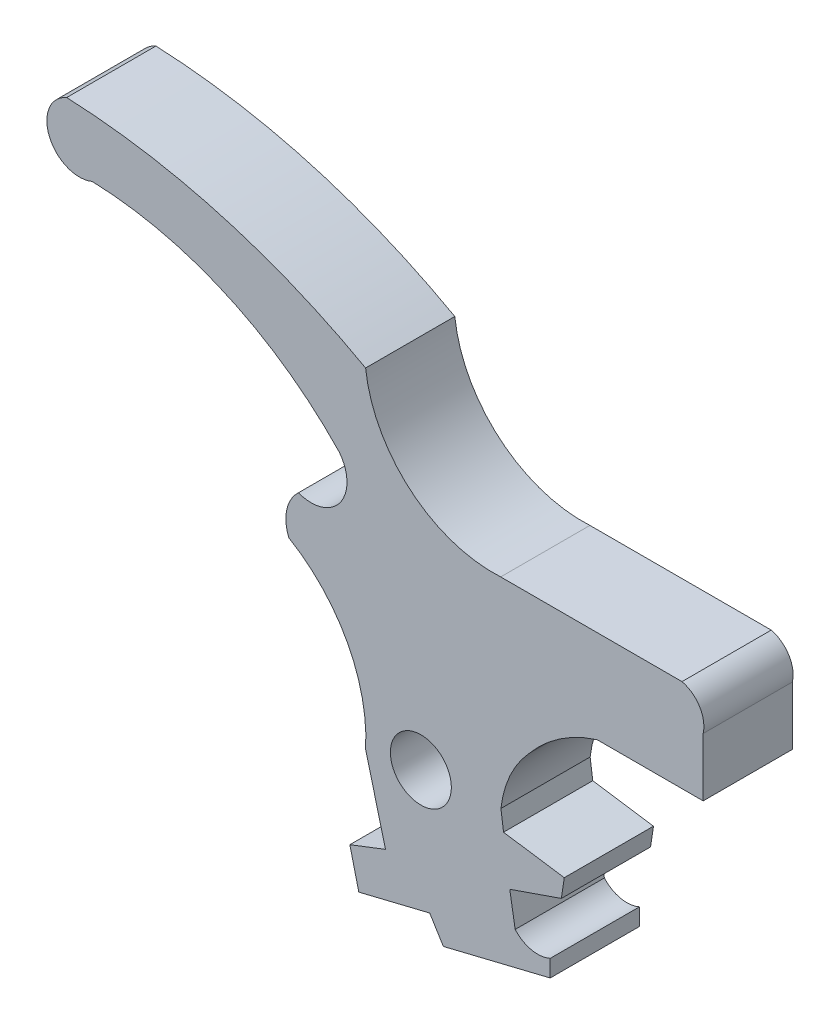
ISO-10303-21;
HEADER;
FILE_DESCRIPTION(('STEP AP214'),'2;1');
FILE_NAME('part.step','',(''),(''),'','','');
FILE_SCHEMA(('AUTOMOTIVE_DESIGN { 1 0 10303 214 1 1 1 1 }'));
ENDSEC;
DATA;
#1=APPLICATION_CONTEXT('core data for automotive mechanical design processes');
#2=APPLICATION_PROTOCOL_DEFINITION('international standard','automotive_design',2000,#1);
#3=PRODUCT_CONTEXT('',#1,'mechanical');
#4=PRODUCT('Part','Part','',(#3));
#5=PRODUCT_RELATED_PRODUCT_CATEGORY('part','',(#4));
#6=PRODUCT_DEFINITION_FORMATION('','',#4);
#7=PRODUCT_DEFINITION_CONTEXT('part definition',#1,'design');
#8=PRODUCT_DEFINITION('design','',#6,#7);
#9=PRODUCT_DEFINITION_SHAPE('','',#8);
#10=(LENGTH_UNIT() NAMED_UNIT(*) SI_UNIT(.MILLI.,.METRE.));
#11=(NAMED_UNIT(*) PLANE_ANGLE_UNIT() SI_UNIT($,.RADIAN.));
#12=(NAMED_UNIT(*) SI_UNIT($,.STERADIAN.) SOLID_ANGLE_UNIT());
#13=UNCERTAINTY_MEASURE_WITH_UNIT(LENGTH_MEASURE(1.E-05),#10,'distance_accuracy_value','');
#14=(GEOMETRIC_REPRESENTATION_CONTEXT(3) GLOBAL_UNCERTAINTY_ASSIGNED_CONTEXT((#13)) GLOBAL_UNIT_ASSIGNED_CONTEXT((#10,
#11,#12)) REPRESENTATION_CONTEXT('',''));
#15=CARTESIAN_POINT('',(0.,0.,0.));
#16=DIRECTION('',(0.,0.,1.));
#17=DIRECTION('',(1.,0.,0.));
#18=AXIS2_PLACEMENT_3D('',#15,#16,#17);
#19=CARTESIAN_POINT('',(-6.44451293141142,10.0909611423394,3.));
#20=DIRECTION('',(0.,0.,-1.));
#21=DIRECTION('',(-1.,0.,0.));
#22=AXIS2_PLACEMENT_3D('',#19,#20,#21);
#23=PLANE('',#22);
#24=CARTESIAN_POINT('',(-6.44451293141142,10.0909611423394,3.));
#25=DIRECTION('',(0.,0.,1.));
#26=DIRECTION('',(-1.,0.,0.));
#27=AXIS2_PLACEMENT_3D('',#24,#25,#26);
#28=CIRCLE('',#27,2.63335410487942);
#29=CARTESIAN_POINT('',(-8.23267341617785,12.0241026070039,3.));
#30=VERTEX_POINT('',#29);
#31=CARTESIAN_POINT('',(-8.87513846045881,9.07774182786287,3.));
#32=VERTEX_POINT('',#31);
#33=EDGE_CURVE('E289',#30,#32,#28,.T.);
#34=ORIENTED_EDGE('',*,*,#33,.T.);
#35=CARTESIAN_POINT('',(-14.3052510394286,-0.0363931321246758,3.));
#36=DIRECTION('',(0.,0.,-1.));
#37=DIRECTION('',(-1.,0.,0.));
#38=AXIS2_PLACEMENT_3D('',#35,#36,#37);
#39=CIRCLE('',#38,10.6091271407761);
#40=CARTESIAN_POINT('',(-3.71445364448347,-0.65976238736326,3.));
#41=VERTEX_POINT('',#40);
#42=EDGE_CURVE('E147',#32,#41,#39,.T.);
#43=ORIENTED_EDGE('',*,*,#42,.T.);
#44=DIRECTION('',(0.250705085666619,-0.968063510324035,0.));
#45=VECTOR('',#44,1.);
#46=CARTESIAN_POINT('',(-3.71445364448347,-0.659762387363265,3.));
#47=LINE('',#46,#45);
#48=CARTESIAN_POINT('',(-2.37862264790034,-5.81789167027516,3.));
#49=VERTEX_POINT('',#48);
#50=EDGE_CURVE('E358',#41,#49,#47,.T.);
#51=ORIENTED_EDGE('',*,*,#50,.T.);
#52=DIRECTION('',(-0.932792519660125,-0.360413811147846,0.));
#53=VECTOR('',#52,1.);
#54=CARTESIAN_POINT('',(-4.77504574225218,-6.74382531827735,3.));
#55=LINE('',#54,#53);
#56=CARTESIAN_POINT('',(-4.77504574225218,-6.74382531827735,3.));
#57=VERTEX_POINT('',#56);
#58=EDGE_CURVE('E377',#49,#57,#55,.T.);
#59=ORIENTED_EDGE('',*,*,#58,.T.);
#60=DIRECTION('',(0.237384546497684,-0.971415759128958,0.));
#61=VECTOR('',#60,1.);
#62=CARTESIAN_POINT('',(-4.17347402980452,-9.20555355770826,3.));
#63=LINE('',#62,#61);
#64=CARTESIAN_POINT('',(-4.17347402980452,-9.20555355770826,3.));
#65=VERTEX_POINT('',#64);
#66=EDGE_CURVE('E374',#57,#65,#63,.T.);
#67=ORIENTED_EDGE('',*,*,#66,.T.);
#68=DIRECTION('',(0.971415759128958,0.237384546497684,0.));
#69=VECTOR('',#68,1.);
#70=CARTESIAN_POINT('',(0.595403586356808,-8.04018451816283,3.));
#71=LINE('',#70,#69);
#72=CARTESIAN_POINT('',(0.595403586356808,-8.04018451816283,3.));
#73=VERTEX_POINT('',#72);
#74=EDGE_CURVE('E376',#65,#73,#71,.T.);
#75=ORIENTED_EDGE('',*,*,#74,.T.);
#76=DIRECTION('',(0.525446105548671,-0.850826886131212,0.));
#77=VECTOR('',#76,1.);
#78=CARTESIAN_POINT('',(1.51354270038527,-9.52687827262201,3.));
#79=LINE('',#78,#77);
#80=CARTESIAN_POINT('',(1.51354270038527,-9.52687827262201,3.));
#81=VERTEX_POINT('',#80);
#82=EDGE_CURVE('E379',#73,#81,#79,.T.);
#83=ORIENTED_EDGE('',*,*,#82,.T.);
#84=DIRECTION('',(0.971415759128958,0.237384546497684,0.));
#85=VECTOR('',#84,1.);
#86=CARTESIAN_POINT('',(8.69943925497317,-7.77086311766953,3.));
#87=LINE('',#86,#85);
#88=CARTESIAN_POINT('',(8.69943925497317,-7.77086311766953,3.));
#89=VERTEX_POINT('',#88);
#90=EDGE_CURVE('E385',#81,#89,#87,.T.);
#91=ORIENTED_EDGE('',*,*,#90,.T.);
#92=DIRECTION('',(0.,1.,0.));
#93=VECTOR('',#92,1.);
#94=CARTESIAN_POINT('',(8.69943925497317,-6.62630487961312,3.));
#95=LINE('',#94,#93);
#96=CARTESIAN_POINT('',(8.69943925497317,-6.62630487961312,3.));
#97=VERTEX_POINT('',#96);
#98=EDGE_CURVE('E387',#89,#97,#95,.T.);
#99=ORIENTED_EDGE('',*,*,#98,.T.);
#100=CARTESIAN_POINT('',(7.86057654018794,-4.78931197597989,3.));
#101=DIRECTION('',(0.,0.,-1.));
#102=DIRECTION('',(1.,0.,0.));
#103=AXIS2_PLACEMENT_3D('',#100,#101,#102);
#104=CIRCLE('',#103,2.01946368678808);
#105=CARTESIAN_POINT('',(6.34245480215451,-6.1210551834963,3.));
#106=VERTEX_POINT('',#105);
#107=EDGE_CURVE('E389',#97,#106,#104,.T.);
#108=ORIENTED_EDGE('',*,*,#107,.T.);
#109=DIRECTION('',(-0.167107958127994,0.985938603732653,0.));
#110=VECTOR('',#109,1.);
#111=CARTESIAN_POINT('',(5.97675308470108,-3.96341143793328,3.));
#112=LINE('',#111,#110);
#113=CARTESIAN_POINT('',(5.97675308470108,-3.96341143793328,3.));
#114=VERTEX_POINT('',#113);
#115=EDGE_CURVE('E391',#106,#114,#112,.T.);
#116=ORIENTED_EDGE('',*,*,#115,.T.);
#117=DIRECTION('',(0.945075332479466,0.32685259053406,0.));
#118=VECTOR('',#117,1.);
#119=CARTESIAN_POINT('',(9.44839583922337,-2.76275008457067,3.));
#120=LINE('',#119,#118);
#121=CARTESIAN_POINT('',(9.44839583922337,-2.76275008457067,3.));
#122=VERTEX_POINT('',#121);
#123=EDGE_CURVE('E393',#114,#122,#120,.T.);
#124=ORIENTED_EDGE('',*,*,#123,.T.);
#125=DIRECTION('',(0.147473156389497,0.989066058534271,0.));
#126=VECTOR('',#125,1.);
#127=CARTESIAN_POINT('',(9.64314516529665,-1.4566144253273,3.));
#128=LINE('',#127,#126);
#129=CARTESIAN_POINT('',(9.64314516529665,-1.4566144253273,3.));
#130=VERTEX_POINT('',#129);
#131=EDGE_CURVE('E395',#122,#130,#128,.T.);
#132=ORIENTED_EDGE('',*,*,#131,.T.);
#133=DIRECTION('',(-0.989205397582961,0.146535597698087,0.));
#134=VECTOR('',#133,1.);
#135=CARTESIAN_POINT('',(5.55876306168624,-0.851575902243703,3.));
#136=LINE('',#135,#134);
#137=CARTESIAN_POINT('',(5.55876306168624,-0.851575902243703,3.));
#138=VERTEX_POINT('',#137);
#139=EDGE_CURVE('E397',#130,#138,#136,.T.);
#140=ORIENTED_EDGE('',*,*,#139,.T.);
#141=DIRECTION('',(-0.13312705018727,0.991098980177276,0.));
#142=VECTOR('',#141,1.);
#143=CARTESIAN_POINT('',(5.38459849737471,0.445037534539928,3.));
#144=LINE('',#143,#142);
#145=CARTESIAN_POINT('',(5.38459849737471,0.445037534539928,3.));
#146=VERTEX_POINT('',#145);
#147=EDGE_CURVE('E399',#138,#146,#144,.T.);
#148=ORIENTED_EDGE('',*,*,#147,.T.);
#149=CARTESIAN_POINT('',(12.6335509052376,-0.352839652599598,3.));
#150=DIRECTION('',(0.,0.,-1.));
#151=DIRECTION('',(1.,0.,0.));
#152=AXIS2_PLACEMENT_3D('',#149,#150,#151);
#153=CIRCLE('',#152,7.29273055975739);
#154=CARTESIAN_POINT('',(7.29046591655235,4.61056258990558,3.));
#155=VERTEX_POINT('',#154);
#156=EDGE_CURVE('E401',#146,#155,#153,.T.);
#157=ORIENTED_EDGE('',*,*,#156,.T.);
#158=CARTESIAN_POINT('',(14.7381535312166,-1.52280125767907,3.));
#159=DIRECTION('',(0.,0.,-1.));
#160=DIRECTION('',(1.,0.,0.));
#161=AXIS2_PLACEMENT_3D('',#158,#159,#160);
#162=CIRCLE('',#161,9.64811913755636);
#163=CARTESIAN_POINT('',(11.8568786839271,7.68504638152838,3.));
#164=VERTEX_POINT('',#163);
#165=EDGE_CURVE('E403',#155,#164,#162,.T.);
#166=ORIENTED_EDGE('',*,*,#165,.T.);
#167=DIRECTION('',(1.,0.,0.));
#168=VECTOR('',#167,1.);
#169=CARTESIAN_POINT('',(18.9842066840982,7.68504638152838,3.));
#170=LINE('',#169,#168);
#171=CARTESIAN_POINT('',(18.9842066840982,7.68504638152838,3.));
#172=VERTEX_POINT('',#171);
#173=EDGE_CURVE('E405',#164,#172,#170,.T.);
#174=ORIENTED_EDGE('',*,*,#173,.T.);
#175=DIRECTION('',(0.,1.,0.));
#176=VECTOR('',#175,1.);
#177=CARTESIAN_POINT('',(18.9842066840982,11.608441399492,3.));
#178=LINE('',#177,#176);
#179=CARTESIAN_POINT('',(18.9842066840982,11.608441399492,3.));
#180=VERTEX_POINT('',#179);
#181=EDGE_CURVE('E407',#172,#180,#178,.T.);
#182=ORIENTED_EDGE('',*,*,#181,.T.);
#183=CARTESIAN_POINT('',(17.0971082186926,12.0430513790505,3.));
#184=DIRECTION('',(0.,0.,1.));
#185=DIRECTION('',(-1.,0.,0.));
#186=AXIS2_PLACEMENT_3D('',#183,#184,#185);
#187=CIRCLE('',#186,1.93649850308953);
#188=CARTESIAN_POINT('',(17.5625074609801,13.9227933820249,3.));
#189=VERTEX_POINT('',#188);
#190=EDGE_CURVE('E409',#180,#189,#187,.T.);
#191=ORIENTED_EDGE('',*,*,#190,.T.);
#192=DIRECTION('',(-1.,0.,0.));
#193=VECTOR('',#192,1.);
#194=CARTESIAN_POINT('',(5.36881506920685,13.9227933820249,3.));
#195=LINE('',#194,#193);
#196=CARTESIAN_POINT('',(5.36881506920685,13.9227933820249,3.));
#197=VERTEX_POINT('',#196);
#198=EDGE_CURVE('E411',#189,#197,#195,.T.);
#199=ORIENTED_EDGE('',*,*,#198,.T.);
#200=CARTESIAN_POINT('',(4.86599422143396,22.5500349992524,3.));
#201=DIRECTION('',(0.,0.,-1.));
#202=DIRECTION('',(1.,0.,0.));
#203=AXIS2_PLACEMENT_3D('',#200,#201,#202);
#204=CIRCLE('',#203,8.64188212873663);
#205=CARTESIAN_POINT('',(-3.71758697385604,21.54790696809,3.));
#206=VERTEX_POINT('',#205);
#207=EDGE_CURVE('E413',#197,#206,#204,.T.);
#208=ORIENTED_EDGE('',*,*,#207,.T.);
#209=CARTESIAN_POINT('',(-25.8237312746146,-18.098996934253,3.));
#210=DIRECTION('',(0.,0.,1.));
#211=DIRECTION('',(-1.,0.,0.));
#212=AXIS2_PLACEMENT_3D('',#209,#210,#211);
#213=CIRCLE('',#212,45.3933762226118);
#214=CARTESIAN_POINT('',(-23.8173491783059,27.25001667984,3.));
#215=VERTEX_POINT('',#214);
#216=EDGE_CURVE('E220',#206,#215,#213,.T.);
#217=ORIENTED_EDGE('',*,*,#216,.T.);
#218=CARTESIAN_POINT('',(-22.9613169831767,25.2341989300196,3.));
#219=DIRECTION('',(0.,0.,1.));
#220=DIRECTION('',(-1.,0.,0.));
#221=AXIS2_PLACEMENT_3D('',#218,#219,#220);
#222=CIRCLE('',#221,2.19004847425552);
#223=CARTESIAN_POINT('',(-22.1052847880474,23.2183811801991,3.));
#224=VERTEX_POINT('',#223);
#225=EDGE_CURVE('E214',#215,#224,#222,.T.);
#226=ORIENTED_EDGE('',*,*,#225,.T.);
#227=CARTESIAN_POINT('',(-22.8781582633878,-0.755672761163364,3.));
#228=DIRECTION('',(0.,0.,-1.));
#229=DIRECTION('',(1.,0.,0.));
#230=AXIS2_PLACEMENT_3D('',#227,#228,#229);
#231=CIRCLE('',#230,23.9865086203108);
#232=CARTESIAN_POINT('',(-5.48727370567497,15.7643069631749,3.));
#233=VERTEX_POINT('',#232);
#234=EDGE_CURVE('E218',#224,#233,#231,.T.);
#235=ORIENTED_EDGE('',*,*,#234,.T.);
#236=CARTESIAN_POINT('',(-7.37445336856807,14.2718453042842,3.));
#237=DIRECTION('',(0.,0.,-1.));
#238=DIRECTION('',(1.,0.,0.));
#239=AXIS2_PLACEMENT_3D('',#236,#237,#238);
#240=CIRCLE('',#239,2.40601098985357);
#241=EDGE_CURVE('E50',#233,#30,#240,.T.);
#242=ORIENTED_EDGE('',*,*,#241,.T.);
#243=EDGE_LOOP('',(#34,#43,#51,#59,#67,#75,#83,#91,#99,#108,#116,#124,#132,#140,#148,#157,#166,
#174,#182,#191,#199,#208,#217,#226,#235,#242));
#244=FACE_BOUND('',#243,.T.);
#245=CARTESIAN_POINT('',(0.,0.,3.));
#246=DIRECTION('',(0.,0.,1.));
#247=DIRECTION('',(1.,0.,0.));
#248=AXIS2_PLACEMENT_3D('',#245,#246,#247);
#249=CIRCLE('',#248,2.05);
#250=CARTESIAN_POINT('',(2.05,0.,3.));
#251=VERTEX_POINT('',#250);
#252=EDGE_CURVE('E242',#251,#251,#249,.T.);
#253=ORIENTED_EDGE('',*,*,#252,.F.);
#254=EDGE_LOOP('',(#253));
#255=FACE_BOUND('',#254,.T.);
#256=ADVANCED_FACE('F33',(#244,#255),#23,.F.);
#257=CARTESIAN_POINT('',(-6.44451293141142,10.0909611423394,-3.));
#258=DIRECTION('',(0.,0.,-1.));
#259=DIRECTION('',(-1.,0.,0.));
#260=AXIS2_PLACEMENT_3D('',#257,#258,#259);
#261=PLANE('',#260);
#262=CARTESIAN_POINT('',(-6.44451293141142,10.0909611423394,-3.));
#263=DIRECTION('',(0.,0.,1.));
#264=DIRECTION('',(-1.,0.,0.));
#265=AXIS2_PLACEMENT_3D('',#262,#263,#264);
#266=CIRCLE('',#265,2.63335410487942);
#267=CARTESIAN_POINT('',(-8.23267341617785,12.0241026070039,-3.));
#268=VERTEX_POINT('',#267);
#269=CARTESIAN_POINT('',(-8.87513846045881,9.07774182786287,-3.));
#270=VERTEX_POINT('',#269);
#271=EDGE_CURVE('E238',#268,#270,#266,.T.);
#272=ORIENTED_EDGE('',*,*,#271,.F.);
#273=CARTESIAN_POINT('',(-7.37445336856807,14.2718453042842,-3.));
#274=DIRECTION('',(0.,0.,-1.));
#275=DIRECTION('',(1.,0.,0.));
#276=AXIS2_PLACEMENT_3D('',#273,#274,#275);
#277=CIRCLE('',#276,2.40601098985357);
#278=CARTESIAN_POINT('',(-5.48727370567497,15.7643069631749,-3.));
#279=VERTEX_POINT('',#278);
#280=EDGE_CURVE('E139',#279,#268,#277,.T.);
#281=ORIENTED_EDGE('',*,*,#280,.F.);
#282=CARTESIAN_POINT('',(-22.8781582633878,-0.755672761163364,-3.));
#283=DIRECTION('',(0.,0.,-1.));
#284=DIRECTION('',(1.,0.,0.));
#285=AXIS2_PLACEMENT_3D('',#282,#283,#284);
#286=CIRCLE('',#285,23.9865086203108);
#287=CARTESIAN_POINT('',(-22.1052847880474,23.2183811801991,-3.));
#288=VERTEX_POINT('',#287);
#289=EDGE_CURVE('E133',#288,#279,#286,.T.);
#290=ORIENTED_EDGE('',*,*,#289,.F.);
#291=CARTESIAN_POINT('',(-22.9613169831767,25.2341989300196,-3.));
#292=DIRECTION('',(0.,0.,1.));
#293=DIRECTION('',(-1.,0.,0.));
#294=AXIS2_PLACEMENT_3D('',#291,#292,#293);
#295=CIRCLE('',#294,2.19004847425552);
#296=CARTESIAN_POINT('',(-23.8173491783059,27.25001667984,-3.));
#297=VERTEX_POINT('',#296);
#298=EDGE_CURVE('E228',#297,#288,#295,.T.);
#299=ORIENTED_EDGE('',*,*,#298,.F.);
#300=CARTESIAN_POINT('',(-25.8237312746146,-18.098996934253,-3.));
#301=DIRECTION('',(0.,0.,1.));
#302=DIRECTION('',(-1.,0.,0.));
#303=AXIS2_PLACEMENT_3D('',#300,#301,#302);
#304=CIRCLE('',#303,45.3933762226118);
#305=CARTESIAN_POINT('',(-3.71758697385604,21.54790696809,-3.));
#306=VERTEX_POINT('',#305);
#307=EDGE_CURVE('E284',#306,#297,#304,.T.);
#308=ORIENTED_EDGE('',*,*,#307,.F.);
#309=CARTESIAN_POINT('',(4.86599422143396,22.5500349992524,-3.));
#310=DIRECTION('',(0.,0.,-1.));
#311=DIRECTION('',(1.,0.,0.));
#312=AXIS2_PLACEMENT_3D('',#309,#310,#311);
#313=CIRCLE('',#312,8.64188212873663);
#314=CARTESIAN_POINT('',(5.36881506920685,13.9227933820249,-3.));
#315=VERTEX_POINT('',#314);
#316=EDGE_CURVE('E282',#315,#306,#313,.T.);
#317=ORIENTED_EDGE('',*,*,#316,.F.);
#318=DIRECTION('',(-1.,0.,0.));
#319=VECTOR('',#318,1.);
#320=CARTESIAN_POINT('',(5.36881506920685,13.9227933820249,-3.));
#321=LINE('',#320,#319);
#322=CARTESIAN_POINT('',(17.5625074609801,13.9227933820249,-3.));
#323=VERTEX_POINT('',#322);
#324=EDGE_CURVE('E280',#323,#315,#321,.T.);
#325=ORIENTED_EDGE('',*,*,#324,.F.);
#326=CARTESIAN_POINT('',(17.0971082186926,12.0430513790505,-3.));
#327=DIRECTION('',(0.,0.,1.));
#328=DIRECTION('',(-1.,0.,0.));
#329=AXIS2_PLACEMENT_3D('',#326,#327,#328);
#330=CIRCLE('',#329,1.93649850308953);
#331=CARTESIAN_POINT('',(18.9842066840982,11.608441399492,-3.));
#332=VERTEX_POINT('',#331);
#333=EDGE_CURVE('E278',#332,#323,#330,.T.);
#334=ORIENTED_EDGE('',*,*,#333,.F.);
#335=DIRECTION('',(0.,1.,0.));
#336=VECTOR('',#335,1.);
#337=CARTESIAN_POINT('',(18.9842066840982,11.608441399492,-3.));
#338=LINE('',#337,#336);
#339=CARTESIAN_POINT('',(18.9842066840982,7.68504638152838,-3.));
#340=VERTEX_POINT('',#339);
#341=EDGE_CURVE('E276',#340,#332,#338,.T.);
#342=ORIENTED_EDGE('',*,*,#341,.F.);
#343=DIRECTION('',(1.,0.,0.));
#344=VECTOR('',#343,1.);
#345=CARTESIAN_POINT('',(18.9842066840982,7.68504638152838,-3.));
#346=LINE('',#345,#344);
#347=CARTESIAN_POINT('',(11.8568786839271,7.68504638152838,-3.));
#348=VERTEX_POINT('',#347);
#349=EDGE_CURVE('E274',#348,#340,#346,.T.);
#350=ORIENTED_EDGE('',*,*,#349,.F.);
#351=CARTESIAN_POINT('',(14.7381535312166,-1.52280125767907,-3.));
#352=DIRECTION('',(0.,0.,-1.));
#353=DIRECTION('',(1.,0.,0.));
#354=AXIS2_PLACEMENT_3D('',#351,#352,#353);
#355=CIRCLE('',#354,9.64811913755636);
#356=CARTESIAN_POINT('',(7.29046591655235,4.61056258990558,-3.));
#357=VERTEX_POINT('',#356);
#358=EDGE_CURVE('E272',#357,#348,#355,.T.);
#359=ORIENTED_EDGE('',*,*,#358,.F.);
#360=CARTESIAN_POINT('',(12.6335509052376,-0.352839652599598,-3.));
#361=DIRECTION('',(0.,0.,-1.));
#362=DIRECTION('',(1.,0.,0.));
#363=AXIS2_PLACEMENT_3D('',#360,#361,#362);
#364=CIRCLE('',#363,7.29273055975739);
#365=CARTESIAN_POINT('',(5.38459849737471,0.445037534539928,-3.));
#366=VERTEX_POINT('',#365);
#367=EDGE_CURVE('E270',#366,#357,#364,.T.);
#368=ORIENTED_EDGE('',*,*,#367,.F.);
#369=DIRECTION('',(-0.13312705018727,0.991098980177276,0.));
#370=VECTOR('',#369,1.);
#371=CARTESIAN_POINT('',(5.38459849737471,0.445037534539928,-3.));
#372=LINE('',#371,#370);
#373=CARTESIAN_POINT('',(5.55876306168624,-0.851575902243703,-3.));
#374=VERTEX_POINT('',#373);
#375=EDGE_CURVE('E268',#374,#366,#372,.T.);
#376=ORIENTED_EDGE('',*,*,#375,.F.);
#377=DIRECTION('',(-0.989205397582961,0.146535597698087,0.));
#378=VECTOR('',#377,1.);
#379=CARTESIAN_POINT('',(5.55876306168624,-0.851575902243703,-3.));
#380=LINE('',#379,#378);
#381=CARTESIAN_POINT('',(9.64314516529665,-1.4566144253273,-3.));
#382=VERTEX_POINT('',#381);
#383=EDGE_CURVE('E266',#382,#374,#380,.T.);
#384=ORIENTED_EDGE('',*,*,#383,.F.);
#385=DIRECTION('',(0.147473156389497,0.989066058534271,0.));
#386=VECTOR('',#385,1.);
#387=CARTESIAN_POINT('',(9.64314516529665,-1.4566144253273,-3.));
#388=LINE('',#387,#386);
#389=CARTESIAN_POINT('',(9.44839583922337,-2.76275008457067,-3.));
#390=VERTEX_POINT('',#389);
#391=EDGE_CURVE('E264',#390,#382,#388,.T.);
#392=ORIENTED_EDGE('',*,*,#391,.F.);
#393=DIRECTION('',(0.945075332479466,0.32685259053406,0.));
#394=VECTOR('',#393,1.);
#395=CARTESIAN_POINT('',(9.44839583922337,-2.76275008457067,-3.));
#396=LINE('',#395,#394);
#397=CARTESIAN_POINT('',(5.97675308470108,-3.96341143793328,-3.));
#398=VERTEX_POINT('',#397);
#399=EDGE_CURVE('E262',#398,#390,#396,.T.);
#400=ORIENTED_EDGE('',*,*,#399,.F.);
#401=DIRECTION('',(-0.167107958127994,0.985938603732653,0.));
#402=VECTOR('',#401,1.);
#403=CARTESIAN_POINT('',(5.97675308470108,-3.96341143793328,-3.));
#404=LINE('',#403,#402);
#405=CARTESIAN_POINT('',(6.34245480215451,-6.1210551834963,-3.));
#406=VERTEX_POINT('',#405);
#407=EDGE_CURVE('E260',#406,#398,#404,.T.);
#408=ORIENTED_EDGE('',*,*,#407,.F.);
#409=CARTESIAN_POINT('',(7.86057654018794,-4.78931197597989,-3.));
#410=DIRECTION('',(0.,0.,-1.));
#411=DIRECTION('',(1.,0.,0.));
#412=AXIS2_PLACEMENT_3D('',#409,#410,#411);
#413=CIRCLE('',#412,2.01946368678808);
#414=CARTESIAN_POINT('',(8.69943925497317,-6.62630487961312,-3.));
#415=VERTEX_POINT('',#414);
#416=EDGE_CURVE('E258',#415,#406,#413,.T.);
#417=ORIENTED_EDGE('',*,*,#416,.F.);
#418=DIRECTION('',(0.,1.,0.));
#419=VECTOR('',#418,1.);
#420=CARTESIAN_POINT('',(8.69943925497317,-6.62630487961312,-3.));
#421=LINE('',#420,#419);
#422=CARTESIAN_POINT('',(8.69943925497317,-7.77086311766953,-3.));
#423=VERTEX_POINT('',#422);
#424=EDGE_CURVE('E256',#423,#415,#421,.T.);
#425=ORIENTED_EDGE('',*,*,#424,.F.);
#426=DIRECTION('',(0.971415759128958,0.237384546497684,0.));
#427=VECTOR('',#426,1.);
#428=CARTESIAN_POINT('',(8.69943925497317,-7.77086311766953,-3.));
#429=LINE('',#428,#427);
#430=CARTESIAN_POINT('',(1.51354270038527,-9.52687827262201,-3.));
#431=VERTEX_POINT('',#430);
#432=EDGE_CURVE('E254',#431,#423,#429,.T.);
#433=ORIENTED_EDGE('',*,*,#432,.F.);
#434=DIRECTION('',(0.525446105548671,-0.850826886131212,0.));
#435=VECTOR('',#434,1.);
#436=CARTESIAN_POINT('',(1.51354270038527,-9.52687827262201,-3.));
#437=LINE('',#436,#435);
#438=CARTESIAN_POINT('',(0.595403586356808,-8.04018451816283,-3.));
#439=VERTEX_POINT('',#438);
#440=EDGE_CURVE('E252',#439,#431,#437,.T.);
#441=ORIENTED_EDGE('',*,*,#440,.F.);
#442=DIRECTION('',(0.971415759128958,0.237384546497684,0.));
#443=VECTOR('',#442,1.);
#444=CARTESIAN_POINT('',(0.595403586356808,-8.04018451816283,-3.));
#445=LINE('',#444,#443);
#446=CARTESIAN_POINT('',(-4.17347402980452,-9.20555355770826,-3.));
#447=VERTEX_POINT('',#446);
#448=EDGE_CURVE('E250',#447,#439,#445,.T.);
#449=ORIENTED_EDGE('',*,*,#448,.F.);
#450=DIRECTION('',(0.237384546497684,-0.971415759128958,0.));
#451=VECTOR('',#450,1.);
#452=CARTESIAN_POINT('',(-4.17347402980452,-9.20555355770826,-3.));
#453=LINE('',#452,#451);
#454=CARTESIAN_POINT('',(-4.77504574225218,-6.74382531827735,-3.));
#455=VERTEX_POINT('',#454);
#456=EDGE_CURVE('E248',#455,#447,#453,.T.);
#457=ORIENTED_EDGE('',*,*,#456,.F.);
#458=DIRECTION('',(-0.932792519660125,-0.360413811147846,0.));
#459=VECTOR('',#458,1.);
#460=CARTESIAN_POINT('',(-4.77504574225218,-6.74382531827735,-3.));
#461=LINE('',#460,#459);
#462=CARTESIAN_POINT('',(-2.37862264790034,-5.81789167027516,-3.));
#463=VERTEX_POINT('',#462);
#464=EDGE_CURVE('E246',#463,#455,#461,.T.);
#465=ORIENTED_EDGE('',*,*,#464,.F.);
#466=DIRECTION('',(0.250705085666619,-0.968063510324035,0.));
#467=VECTOR('',#466,1.);
#468=CARTESIAN_POINT('',(-3.71445364448347,-0.659762387363265,-3.));
#469=LINE('',#468,#467);
#470=CARTESIAN_POINT('',(-3.71445364448347,-0.65976238736326,-3.));
#471=VERTEX_POINT('',#470);
#472=EDGE_CURVE('E244',#471,#463,#469,.T.);
#473=ORIENTED_EDGE('',*,*,#472,.F.);
#474=CARTESIAN_POINT('',(-14.3052510394286,-0.0363931321246758,-3.));
#475=DIRECTION('',(0.,0.,-1.));
#476=DIRECTION('',(-1.,0.,0.));
#477=AXIS2_PLACEMENT_3D('',#474,#475,#476);
#478=CIRCLE('',#477,10.6091271407761);
#479=EDGE_CURVE('E241',#270,#471,#478,.T.);
#480=ORIENTED_EDGE('',*,*,#479,.F.);
#481=EDGE_LOOP('',(#272,#281,#290,#299,#308,#317,#325,#334,#342,#350,#359,#368,#376,#384,#392,
#400,#408,#417,#425,#433,#441,#449,#457,#465,#473,#480));
#482=FACE_BOUND('',#481,.T.);
#483=CARTESIAN_POINT('',(0.,0.,-3.));
#484=DIRECTION('',(0.,0.,1.));
#485=DIRECTION('',(1.,0.,0.));
#486=AXIS2_PLACEMENT_3D('',#483,#484,#485);
#487=CIRCLE('',#486,2.05);
#488=CARTESIAN_POINT('',(2.05,0.,-3.));
#489=VERTEX_POINT('',#488);
#490=EDGE_CURVE('E742',#489,#489,#487,.T.);
#491=ORIENTED_EDGE('',*,*,#490,.T.);
#492=EDGE_LOOP('',(#491));
#493=FACE_BOUND('',#492,.T.);
#494=ADVANCED_FACE('F362',(#482,#493),#261,.T.);
#495=CARTESIAN_POINT('',(-6.44451293141142,10.0909611423394,3.));
#496=DIRECTION('',(0.,0.,-1.));
#497=DIRECTION('',(-1.,0.,0.));
#498=AXIS2_PLACEMENT_3D('',#495,#496,#497);
#499=CYLINDRICAL_SURFACE('',#498,2.63335410487942);
#500=ORIENTED_EDGE('',*,*,#271,.T.);
#501=DIRECTION('',(0.,0.,-1.));
#502=VECTOR('',#501,1.);
#503=CARTESIAN_POINT('',(-8.87513846045881,9.07774182786287,3.));
#504=LINE('',#503,#502);
#505=EDGE_CURVE('E11',#32,#270,#504,.T.);
#506=ORIENTED_EDGE('',*,*,#505,.F.);
#507=ORIENTED_EDGE('',*,*,#33,.F.);
#508=DIRECTION('',(0.,0.,-1.));
#509=VECTOR('',#508,1.);
#510=CARTESIAN_POINT('',(-8.23267341617785,12.0241026070039,3.));
#511=LINE('',#510,#509);
#512=EDGE_CURVE('E234',#30,#268,#511,.T.);
#513=ORIENTED_EDGE('',*,*,#512,.T.);
#514=EDGE_LOOP('',(#500,#506,#507,#513));
#515=FACE_BOUND('',#514,.T.);
#516=ADVANCED_FACE('F35',(#515),#499,.T.);
#517=CARTESIAN_POINT('',(-14.3052510394286,-0.0363931321246758,3.));
#518=DIRECTION('',(0.,0.,-1.));
#519=DIRECTION('',(-1.,0.,0.));
#520=AXIS2_PLACEMENT_3D('',#517,#518,#519);
#521=CYLINDRICAL_SURFACE('',#520,10.6091271407761);
#522=ORIENTED_EDGE('',*,*,#479,.T.);
#523=DIRECTION('',(0.,0.,-1.));
#524=VECTOR('',#523,1.);
#525=CARTESIAN_POINT('',(-3.71445364448347,-0.65976238736326,3.));
#526=LINE('',#525,#524);
#527=EDGE_CURVE('E42',#41,#471,#526,.T.);
#528=ORIENTED_EDGE('',*,*,#527,.F.);
#529=ORIENTED_EDGE('',*,*,#42,.F.);
#530=ORIENTED_EDGE('',*,*,#505,.T.);
#531=EDGE_LOOP('',(#522,#528,#529,#530));
#532=FACE_BOUND('',#531,.T.);
#533=ADVANCED_FACE('F447',(#532),#521,.F.);
#534=CARTESIAN_POINT('',(-3.71445364448347,-0.659762387363265,3.));
#535=DIRECTION('',(0.968063510324035,0.250705085666619,0.));
#536=DIRECTION('',(-0.250705085666619,0.968063510324035,0.));
#537=AXIS2_PLACEMENT_3D('',#534,#535,#536);
#538=PLANE('',#537);
#539=ORIENTED_EDGE('',*,*,#472,.T.);
#540=DIRECTION('',(0.,0.,-1.));
#541=VECTOR('',#540,1.);
#542=CARTESIAN_POINT('',(-2.37862264790034,-5.81789167027516,3.));
#543=LINE('',#542,#541);
#544=EDGE_CURVE('E350',#49,#463,#543,.T.);
#545=ORIENTED_EDGE('',*,*,#544,.F.);
#546=ORIENTED_EDGE('',*,*,#50,.F.);
#547=ORIENTED_EDGE('',*,*,#527,.T.);
#548=EDGE_LOOP('',(#539,#545,#546,#547));
#549=FACE_BOUND('',#548,.T.);
#550=ADVANCED_FACE('F356',(#549),#538,.F.);
#551=CARTESIAN_POINT('',(-4.77504574225218,-6.74382531827735,3.));
#552=DIRECTION('',(0.360413811147846,-0.932792519660125,0.));
#553=DIRECTION('',(0.932792519660125,0.360413811147846,0.));
#554=AXIS2_PLACEMENT_3D('',#551,#552,#553);
#555=PLANE('',#554);
#556=ORIENTED_EDGE('',*,*,#464,.T.);
#557=DIRECTION('',(0.,0.,-1.));
#558=VECTOR('',#557,1.);
#559=CARTESIAN_POINT('',(-4.77504574225218,-6.74382531827735,3.));
#560=LINE('',#559,#558);
#561=EDGE_CURVE('E347',#57,#455,#560,.T.);
#562=ORIENTED_EDGE('',*,*,#561,.F.);
#563=ORIENTED_EDGE('',*,*,#58,.F.);
#564=ORIENTED_EDGE('',*,*,#544,.T.);
#565=EDGE_LOOP('',(#556,#562,#563,#564));
#566=FACE_BOUND('',#565,.T.);
#567=ADVANCED_FACE('F368',(#566),#555,.F.);
#568=CARTESIAN_POINT('',(-4.17347402980452,-9.20555355770826,3.));
#569=DIRECTION('',(0.971415759128958,0.237384546497684,0.));
#570=DIRECTION('',(-0.237384546497684,0.971415759128958,0.));
#571=AXIS2_PLACEMENT_3D('',#568,#569,#570);
#572=PLANE('',#571);
#573=ORIENTED_EDGE('',*,*,#456,.T.);
#574=DIRECTION('',(0.,0.,-1.));
#575=VECTOR('',#574,1.);
#576=CARTESIAN_POINT('',(-4.17347402980452,-9.20555355770826,3.));
#577=LINE('',#576,#575);
#578=EDGE_CURVE('E344',#65,#447,#577,.T.);
#579=ORIENTED_EDGE('',*,*,#578,.F.);
#580=ORIENTED_EDGE('',*,*,#66,.F.);
#581=ORIENTED_EDGE('',*,*,#561,.T.);
#582=EDGE_LOOP('',(#573,#579,#580,#581));
#583=FACE_BOUND('',#582,.T.);
#584=ADVANCED_FACE('F372',(#583),#572,.F.);
#585=CARTESIAN_POINT('',(0.595403586356808,-8.04018451816283,3.));
#586=DIRECTION('',(-0.237384546497684,0.971415759128958,0.));
#587=DIRECTION('',(-0.971415759128958,-0.237384546497684,0.));
#588=AXIS2_PLACEMENT_3D('',#585,#586,#587);
#589=PLANE('',#588);
#590=ORIENTED_EDGE('',*,*,#448,.T.);
#591=DIRECTION('',(0.,0.,-1.));
#592=VECTOR('',#591,1.);
#593=CARTESIAN_POINT('',(0.595403586356808,-8.04018451816283,3.));
#594=LINE('',#593,#592);
#595=EDGE_CURVE('E341',#73,#439,#594,.T.);
#596=ORIENTED_EDGE('',*,*,#595,.F.);
#597=ORIENTED_EDGE('',*,*,#74,.F.);
#598=ORIENTED_EDGE('',*,*,#578,.T.);
#599=EDGE_LOOP('',(#590,#596,#597,#598));
#600=FACE_BOUND('',#599,.T.);
#601=ADVANCED_FACE('F460',(#600),#589,.F.);
#602=CARTESIAN_POINT('',(1.51354270038527,-9.52687827262201,3.));
#603=DIRECTION('',(0.850826886131212,0.525446105548672,0.));
#604=DIRECTION('',(-0.525446105548672,0.850826886131212,0.));
#605=AXIS2_PLACEMENT_3D('',#602,#603,#604);
#606=PLANE('',#605);
#607=ORIENTED_EDGE('',*,*,#440,.T.);
#608=DIRECTION('',(0.,0.,-1.));
#609=VECTOR('',#608,1.);
#610=CARTESIAN_POINT('',(1.51354270038527,-9.52687827262201,3.));
#611=LINE('',#610,#609);
#612=EDGE_CURVE('E338',#81,#431,#611,.T.);
#613=ORIENTED_EDGE('',*,*,#612,.F.);
#614=ORIENTED_EDGE('',*,*,#82,.F.);
#615=ORIENTED_EDGE('',*,*,#595,.T.);
#616=EDGE_LOOP('',(#607,#613,#614,#615));
#617=FACE_BOUND('',#616,.T.);
#618=ADVANCED_FACE('F463',(#617),#606,.F.);
#619=CARTESIAN_POINT('',(8.69943925497317,-7.77086311766953,3.));
#620=DIRECTION('',(-0.237384546497684,0.971415759128958,0.));
#621=DIRECTION('',(-0.971415759128958,-0.237384546497684,0.));
#622=AXIS2_PLACEMENT_3D('',#619,#620,#621);
#623=PLANE('',#622);
#624=ORIENTED_EDGE('',*,*,#432,.T.);
#625=DIRECTION('',(0.,0.,-1.));
#626=VECTOR('',#625,1.);
#627=CARTESIAN_POINT('',(8.69943925497317,-7.77086311766953,3.));
#628=LINE('',#627,#626);
#629=EDGE_CURVE('E335',#89,#423,#628,.T.);
#630=ORIENTED_EDGE('',*,*,#629,.F.);
#631=ORIENTED_EDGE('',*,*,#90,.F.);
#632=ORIENTED_EDGE('',*,*,#612,.T.);
#633=EDGE_LOOP('',(#624,#630,#631,#632));
#634=FACE_BOUND('',#633,.T.);
#635=ADVANCED_FACE('F467',(#634),#623,.F.);
#636=CARTESIAN_POINT('',(8.69943925497317,-6.62630487961312,3.));
#637=DIRECTION('',(-1.,0.,0.));
#638=DIRECTION('',(0.,0.,1.));
#639=AXIS2_PLACEMENT_3D('',#636,#637,#638);
#640=PLANE('',#639);
#641=ORIENTED_EDGE('',*,*,#424,.T.);
#642=DIRECTION('',(0.,0.,-1.));
#643=VECTOR('',#642,1.);
#644=CARTESIAN_POINT('',(8.69943925497317,-6.62630487961312,3.));
#645=LINE('',#644,#643);
#646=EDGE_CURVE('E332',#97,#415,#645,.T.);
#647=ORIENTED_EDGE('',*,*,#646,.F.);
#648=ORIENTED_EDGE('',*,*,#98,.F.);
#649=ORIENTED_EDGE('',*,*,#629,.T.);
#650=EDGE_LOOP('',(#641,#647,#648,#649));
#651=FACE_BOUND('',#650,.T.);
#652=ADVANCED_FACE('F471',(#651),#640,.F.);
#653=CARTESIAN_POINT('',(7.86057654018794,-4.78931197597989,3.));
#654=DIRECTION('',(0.,0.,-1.));
#655=DIRECTION('',(-1.,0.,0.));
#656=AXIS2_PLACEMENT_3D('',#653,#654,#655);
#657=CYLINDRICAL_SURFACE('',#656,2.01946368678808);
#658=ORIENTED_EDGE('',*,*,#416,.T.);
#659=DIRECTION('',(0.,0.,-1.));
#660=VECTOR('',#659,1.);
#661=CARTESIAN_POINT('',(6.34245480215451,-6.1210551834963,3.));
#662=LINE('',#661,#660);
#663=EDGE_CURVE('E329',#106,#406,#662,.T.);
#664=ORIENTED_EDGE('',*,*,#663,.F.);
#665=ORIENTED_EDGE('',*,*,#107,.F.);
#666=ORIENTED_EDGE('',*,*,#646,.T.);
#667=EDGE_LOOP('',(#658,#664,#665,#666));
#668=FACE_BOUND('',#667,.T.);
#669=ADVANCED_FACE('F475',(#668),#657,.F.);
#670=CARTESIAN_POINT('',(5.97675308470108,-3.96341143793328,3.));
#671=DIRECTION('',(-0.985938603732653,-0.167107958127994,0.));
#672=DIRECTION('',(0.167107958127994,-0.985938603732653,0.));
#673=AXIS2_PLACEMENT_3D('',#670,#671,#672);
#674=PLANE('',#673);
#675=ORIENTED_EDGE('',*,*,#407,.T.);
#676=DIRECTION('',(0.,0.,-1.));
#677=VECTOR('',#676,1.);
#678=CARTESIAN_POINT('',(5.97675308470108,-3.96341143793328,3.));
#679=LINE('',#678,#677);
#680=EDGE_CURVE('E326',#114,#398,#679,.T.);
#681=ORIENTED_EDGE('',*,*,#680,.F.);
#682=ORIENTED_EDGE('',*,*,#115,.F.);
#683=ORIENTED_EDGE('',*,*,#663,.T.);
#684=EDGE_LOOP('',(#675,#681,#682,#683));
#685=FACE_BOUND('',#684,.T.);
#686=ADVANCED_FACE('F479',(#685),#674,.F.);
#687=CARTESIAN_POINT('',(9.44839583922337,-2.76275008457067,3.));
#688=DIRECTION('',(-0.32685259053406,0.945075332479466,0.));
#689=DIRECTION('',(-0.945075332479466,-0.32685259053406,0.));
#690=AXIS2_PLACEMENT_3D('',#687,#688,#689);
#691=PLANE('',#690);
#692=ORIENTED_EDGE('',*,*,#399,.T.);
#693=DIRECTION('',(0.,0.,-1.));
#694=VECTOR('',#693,1.);
#695=CARTESIAN_POINT('',(9.44839583922337,-2.76275008457067,3.));
#696=LINE('',#695,#694);
#697=EDGE_CURVE('E323',#122,#390,#696,.T.);
#698=ORIENTED_EDGE('',*,*,#697,.F.);
#699=ORIENTED_EDGE('',*,*,#123,.F.);
#700=ORIENTED_EDGE('',*,*,#680,.T.);
#701=EDGE_LOOP('',(#692,#698,#699,#700));
#702=FACE_BOUND('',#701,.T.);
#703=ADVANCED_FACE('F483',(#702),#691,.F.);
#704=CARTESIAN_POINT('',(9.64314516529665,-1.4566144253273,3.));
#705=DIRECTION('',(-0.989066058534271,0.147473156389497,0.));
#706=DIRECTION('',(-0.147473156389497,-0.989066058534272,0.));
#707=AXIS2_PLACEMENT_3D('',#704,#705,#706);
#708=PLANE('',#707);
#709=ORIENTED_EDGE('',*,*,#391,.T.);
#710=DIRECTION('',(0.,0.,-1.));
#711=VECTOR('',#710,1.);
#712=CARTESIAN_POINT('',(9.64314516529665,-1.4566144253273,3.));
#713=LINE('',#712,#711);
#714=EDGE_CURVE('E320',#130,#382,#713,.T.);
#715=ORIENTED_EDGE('',*,*,#714,.F.);
#716=ORIENTED_EDGE('',*,*,#131,.F.);
#717=ORIENTED_EDGE('',*,*,#697,.T.);
#718=EDGE_LOOP('',(#709,#715,#716,#717));
#719=FACE_BOUND('',#718,.T.);
#720=ADVANCED_FACE('F487',(#719),#708,.F.);
#721=CARTESIAN_POINT('',(5.55876306168624,-0.851575902243703,3.));
#722=DIRECTION('',(-0.146535597698087,-0.989205397582961,0.));
#723=DIRECTION('',(0.989205397582961,-0.146535597698087,0.));
#724=AXIS2_PLACEMENT_3D('',#721,#722,#723);
#725=PLANE('',#724);
#726=ORIENTED_EDGE('',*,*,#383,.T.);
#727=DIRECTION('',(0.,0.,-1.));
#728=VECTOR('',#727,1.);
#729=CARTESIAN_POINT('',(5.55876306168624,-0.851575902243703,3.));
#730=LINE('',#729,#728);
#731=EDGE_CURVE('E317',#138,#374,#730,.T.);
#732=ORIENTED_EDGE('',*,*,#731,.F.);
#733=ORIENTED_EDGE('',*,*,#139,.F.);
#734=ORIENTED_EDGE('',*,*,#714,.T.);
#735=EDGE_LOOP('',(#726,#732,#733,#734));
#736=FACE_BOUND('',#735,.T.);
#737=ADVANCED_FACE('F491',(#736),#725,.F.);
#738=CARTESIAN_POINT('',(5.38459849737471,0.445037534539928,3.));
#739=DIRECTION('',(-0.991098980177276,-0.13312705018727,0.));
#740=DIRECTION('',(0.13312705018727,-0.991098980177276,0.));
#741=AXIS2_PLACEMENT_3D('',#738,#739,#740);
#742=PLANE('',#741);
#743=ORIENTED_EDGE('',*,*,#375,.T.);
#744=DIRECTION('',(0.,0.,-1.));
#745=VECTOR('',#744,1.);
#746=CARTESIAN_POINT('',(5.38459849737471,0.445037534539928,3.));
#747=LINE('',#746,#745);
#748=EDGE_CURVE('E314',#146,#366,#747,.T.);
#749=ORIENTED_EDGE('',*,*,#748,.F.);
#750=ORIENTED_EDGE('',*,*,#147,.F.);
#751=ORIENTED_EDGE('',*,*,#731,.T.);
#752=EDGE_LOOP('',(#743,#749,#750,#751));
#753=FACE_BOUND('',#752,.T.);
#754=ADVANCED_FACE('F495',(#753),#742,.F.);
#755=CARTESIAN_POINT('',(12.6335509052376,-0.352839652599598,3.));
#756=DIRECTION('',(0.,0.,-1.));
#757=DIRECTION('',(-1.,0.,0.));
#758=AXIS2_PLACEMENT_3D('',#755,#756,#757);
#759=CYLINDRICAL_SURFACE('',#758,7.29273055975739);
#760=ORIENTED_EDGE('',*,*,#367,.T.);
#761=DIRECTION('',(0.,0.,-1.));
#762=VECTOR('',#761,1.);
#763=CARTESIAN_POINT('',(7.29046591655235,4.61056258990558,3.));
#764=LINE('',#763,#762);
#765=EDGE_CURVE('E311',#155,#357,#764,.T.);
#766=ORIENTED_EDGE('',*,*,#765,.F.);
#767=ORIENTED_EDGE('',*,*,#156,.F.);
#768=ORIENTED_EDGE('',*,*,#748,.T.);
#769=EDGE_LOOP('',(#760,#766,#767,#768));
#770=FACE_BOUND('',#769,.T.);
#771=ADVANCED_FACE('F499',(#770),#759,.F.);
#772=CARTESIAN_POINT('',(14.7381535312166,-1.52280125767907,3.));
#773=DIRECTION('',(0.,0.,-1.));
#774=DIRECTION('',(-1.,0.,0.));
#775=AXIS2_PLACEMENT_3D('',#772,#773,#774);
#776=CYLINDRICAL_SURFACE('',#775,9.64811913755636);
#777=ORIENTED_EDGE('',*,*,#358,.T.);
#778=DIRECTION('',(0.,0.,-1.));
#779=VECTOR('',#778,1.);
#780=CARTESIAN_POINT('',(11.8568786839271,7.68504638152838,3.));
#781=LINE('',#780,#779);
#782=EDGE_CURVE('E308',#164,#348,#781,.T.);
#783=ORIENTED_EDGE('',*,*,#782,.F.);
#784=ORIENTED_EDGE('',*,*,#165,.F.);
#785=ORIENTED_EDGE('',*,*,#765,.T.);
#786=EDGE_LOOP('',(#777,#783,#784,#785));
#787=FACE_BOUND('',#786,.T.);
#788=ADVANCED_FACE('F503',(#787),#776,.F.);
#789=CARTESIAN_POINT('',(18.9842066840982,7.68504638152838,3.));
#790=DIRECTION('',(0.,1.,0.));
#791=DIRECTION('',(0.,0.,1.));
#792=AXIS2_PLACEMENT_3D('',#789,#790,#791);
#793=PLANE('',#792);
#794=ORIENTED_EDGE('',*,*,#349,.T.);
#795=DIRECTION('',(0.,0.,-1.));
#796=VECTOR('',#795,1.);
#797=CARTESIAN_POINT('',(18.9842066840982,7.68504638152838,3.));
#798=LINE('',#797,#796);
#799=EDGE_CURVE('E305',#172,#340,#798,.T.);
#800=ORIENTED_EDGE('',*,*,#799,.F.);
#801=ORIENTED_EDGE('',*,*,#173,.F.);
#802=ORIENTED_EDGE('',*,*,#782,.T.);
#803=EDGE_LOOP('',(#794,#800,#801,#802));
#804=FACE_BOUND('',#803,.T.);
#805=ADVANCED_FACE('F507',(#804),#793,.F.);
#806=CARTESIAN_POINT('',(18.9842066840982,11.608441399492,3.));
#807=DIRECTION('',(-1.,0.,0.));
#808=DIRECTION('',(0.,0.,1.));
#809=AXIS2_PLACEMENT_3D('',#806,#807,#808);
#810=PLANE('',#809);
#811=ORIENTED_EDGE('',*,*,#341,.T.);
#812=DIRECTION('',(0.,0.,-1.));
#813=VECTOR('',#812,1.);
#814=CARTESIAN_POINT('',(18.9842066840982,11.608441399492,3.));
#815=LINE('',#814,#813);
#816=EDGE_CURVE('E302',#180,#332,#815,.T.);
#817=ORIENTED_EDGE('',*,*,#816,.F.);
#818=ORIENTED_EDGE('',*,*,#181,.F.);
#819=ORIENTED_EDGE('',*,*,#799,.T.);
#820=EDGE_LOOP('',(#811,#817,#818,#819));
#821=FACE_BOUND('',#820,.T.);
#822=ADVANCED_FACE('F511',(#821),#810,.F.);
#823=CARTESIAN_POINT('',(17.0971082186926,12.0430513790505,3.));
#824=DIRECTION('',(0.,0.,-1.));
#825=DIRECTION('',(-1.,0.,0.));
#826=AXIS2_PLACEMENT_3D('',#823,#824,#825);
#827=CYLINDRICAL_SURFACE('',#826,1.93649850308953);
#828=ORIENTED_EDGE('',*,*,#333,.T.);
#829=DIRECTION('',(0.,0.,-1.));
#830=VECTOR('',#829,1.);
#831=CARTESIAN_POINT('',(17.5625074609801,13.9227933820249,3.));
#832=LINE('',#831,#830);
#833=EDGE_CURVE('E299',#189,#323,#832,.T.);
#834=ORIENTED_EDGE('',*,*,#833,.F.);
#835=ORIENTED_EDGE('',*,*,#190,.F.);
#836=ORIENTED_EDGE('',*,*,#816,.T.);
#837=EDGE_LOOP('',(#828,#834,#835,#836));
#838=FACE_BOUND('',#837,.T.);
#839=ADVANCED_FACE('F515',(#838),#827,.T.);
#840=CARTESIAN_POINT('',(5.36881506920685,13.9227933820249,3.));
#841=DIRECTION('',(0.,-1.,0.));
#842=DIRECTION('',(0.,0.,-1.));
#843=AXIS2_PLACEMENT_3D('',#840,#841,#842);
#844=PLANE('',#843);
#845=ORIENTED_EDGE('',*,*,#324,.T.);
#846=DIRECTION('',(0.,0.,-1.));
#847=VECTOR('',#846,1.);
#848=CARTESIAN_POINT('',(5.36881506920685,13.9227933820249,3.));
#849=LINE('',#848,#847);
#850=EDGE_CURVE('E296',#197,#315,#849,.T.);
#851=ORIENTED_EDGE('',*,*,#850,.F.);
#852=ORIENTED_EDGE('',*,*,#198,.F.);
#853=ORIENTED_EDGE('',*,*,#833,.T.);
#854=EDGE_LOOP('',(#845,#851,#852,#853));
#855=FACE_BOUND('',#854,.T.);
#856=ADVANCED_FACE('F519',(#855),#844,.F.);
#857=CARTESIAN_POINT('',(4.86599422143396,22.5500349992524,3.));
#858=DIRECTION('',(0.,0.,-1.));
#859=DIRECTION('',(-1.,0.,0.));
#860=AXIS2_PLACEMENT_3D('',#857,#858,#859);
#861=CYLINDRICAL_SURFACE('',#860,8.64188212873663);
#862=ORIENTED_EDGE('',*,*,#316,.T.);
#863=DIRECTION('',(0.,0.,-1.));
#864=VECTOR('',#863,1.);
#865=CARTESIAN_POINT('',(-3.71758697385604,21.54790696809,3.));
#866=LINE('',#865,#864);
#867=EDGE_CURVE('E293',#206,#306,#866,.T.);
#868=ORIENTED_EDGE('',*,*,#867,.F.);
#869=ORIENTED_EDGE('',*,*,#207,.F.);
#870=ORIENTED_EDGE('',*,*,#850,.T.);
#871=EDGE_LOOP('',(#862,#868,#869,#870));
#872=FACE_BOUND('',#871,.T.);
#873=ADVANCED_FACE('F419',(#872),#861,.F.);
#874=CARTESIAN_POINT('',(-25.8237312746146,-18.098996934253,3.));
#875=DIRECTION('',(0.,0.,-1.));
#876=DIRECTION('',(-1.,0.,0.));
#877=AXIS2_PLACEMENT_3D('',#874,#875,#876);
#878=CYLINDRICAL_SURFACE('',#877,45.3933762226118);
#879=ORIENTED_EDGE('',*,*,#307,.T.);
#880=DIRECTION('',(0.,0.,-1.));
#881=VECTOR('',#880,1.);
#882=CARTESIAN_POINT('',(-23.8173491783059,27.25001667984,3.));
#883=LINE('',#882,#881);
#884=EDGE_CURVE('E229',#215,#297,#883,.T.);
#885=ORIENTED_EDGE('',*,*,#884,.F.);
#886=ORIENTED_EDGE('',*,*,#216,.F.);
#887=ORIENTED_EDGE('',*,*,#867,.T.);
#888=EDGE_LOOP('',(#879,#885,#886,#887));
#889=FACE_BOUND('',#888,.T.);
#890=ADVANCED_FACE('F423',(#889),#878,.T.);
#891=CARTESIAN_POINT('',(-22.9613169831767,25.2341989300196,3.));
#892=DIRECTION('',(0.,0.,-1.));
#893=DIRECTION('',(-1.,0.,0.));
#894=AXIS2_PLACEMENT_3D('',#891,#892,#893);
#895=CYLINDRICAL_SURFACE('',#894,2.19004847425552);
#896=ORIENTED_EDGE('',*,*,#298,.T.);
#897=DIRECTION('',(0.,0.,-1.));
#898=VECTOR('',#897,1.);
#899=CARTESIAN_POINT('',(-22.1052847880474,23.2183811801991,3.));
#900=LINE('',#899,#898);
#901=EDGE_CURVE('E225',#224,#288,#900,.T.);
#902=ORIENTED_EDGE('',*,*,#901,.F.);
#903=ORIENTED_EDGE('',*,*,#225,.F.);
#904=ORIENTED_EDGE('',*,*,#884,.T.);
#905=EDGE_LOOP('',(#896,#902,#903,#904));
#906=FACE_BOUND('',#905,.T.);
#907=ADVANCED_FACE('F226',(#906),#895,.T.);
#908=CARTESIAN_POINT('',(-22.8781582633878,-0.755672761163364,3.));
#909=DIRECTION('',(0.,0.,-1.));
#910=DIRECTION('',(-1.,0.,0.));
#911=AXIS2_PLACEMENT_3D('',#908,#909,#910);
#912=CYLINDRICAL_SURFACE('',#911,23.9865086203108);
#913=ORIENTED_EDGE('',*,*,#289,.T.);
#914=DIRECTION('',(0.,0.,-1.));
#915=VECTOR('',#914,1.);
#916=CARTESIAN_POINT('',(-5.48727370567497,15.7643069631749,3.));
#917=LINE('',#916,#915);
#918=EDGE_CURVE('E230',#233,#279,#917,.T.);
#919=ORIENTED_EDGE('',*,*,#918,.F.);
#920=ORIENTED_EDGE('',*,*,#234,.F.);
#921=ORIENTED_EDGE('',*,*,#901,.T.);
#922=EDGE_LOOP('',(#913,#919,#920,#921));
#923=FACE_BOUND('',#922,.T.);
#924=ADVANCED_FACE('F232',(#923),#912,.F.);
#925=CARTESIAN_POINT('',(-7.37445336856807,14.2718453042842,3.));
#926=DIRECTION('',(0.,0.,-1.));
#927=DIRECTION('',(-1.,0.,0.));
#928=AXIS2_PLACEMENT_3D('',#925,#926,#927);
#929=CYLINDRICAL_SURFACE('',#928,2.40601098985357);
#930=ORIENTED_EDGE('',*,*,#280,.T.);
#931=ORIENTED_EDGE('',*,*,#512,.F.);
#932=ORIENTED_EDGE('',*,*,#241,.F.);
#933=ORIENTED_EDGE('',*,*,#918,.T.);
#934=EDGE_LOOP('',(#930,#931,#932,#933));
#935=FACE_BOUND('',#934,.T.);
#936=ADVANCED_FACE('F427',(#935),#929,.F.);
#937=CARTESIAN_POINT('',(0.,0.,3.));
#938=DIRECTION('',(0.,0.,-1.));
#939=DIRECTION('',(-1.,0.,0.));
#940=AXIS2_PLACEMENT_3D('',#937,#938,#939);
#941=CYLINDRICAL_SURFACE('',#940,2.05);
#942=ORIENTED_EDGE('',*,*,#252,.T.);
#943=EDGE_LOOP('',(#942));
#944=FACE_BOUND('',#943,.T.);
#945=ORIENTED_EDGE('',*,*,#490,.F.);
#946=EDGE_LOOP('',(#945));
#947=FACE_BOUND('',#946,.T.);
#948=ADVANCED_FACE('F429',(#944,#947),#941,.F.);
#949=CLOSED_SHELL('',(#256,#494,#516,#533,#550,#567,#584,#601,#618,#635,#652,#669,#686,#703,
#720,#737,#754,#771,#788,#805,#822,#839,#856,#873,#890,#907,#924,#936,#948));
#950=MANIFOLD_SOLID_BREP('B2',#949);
#951=ADVANCED_BREP_SHAPE_REPRESENTATION('',(#18,#950),#14);
#952=SHAPE_DEFINITION_REPRESENTATION(#9,#951);
ENDSEC;
END-ISO-10303-21;
